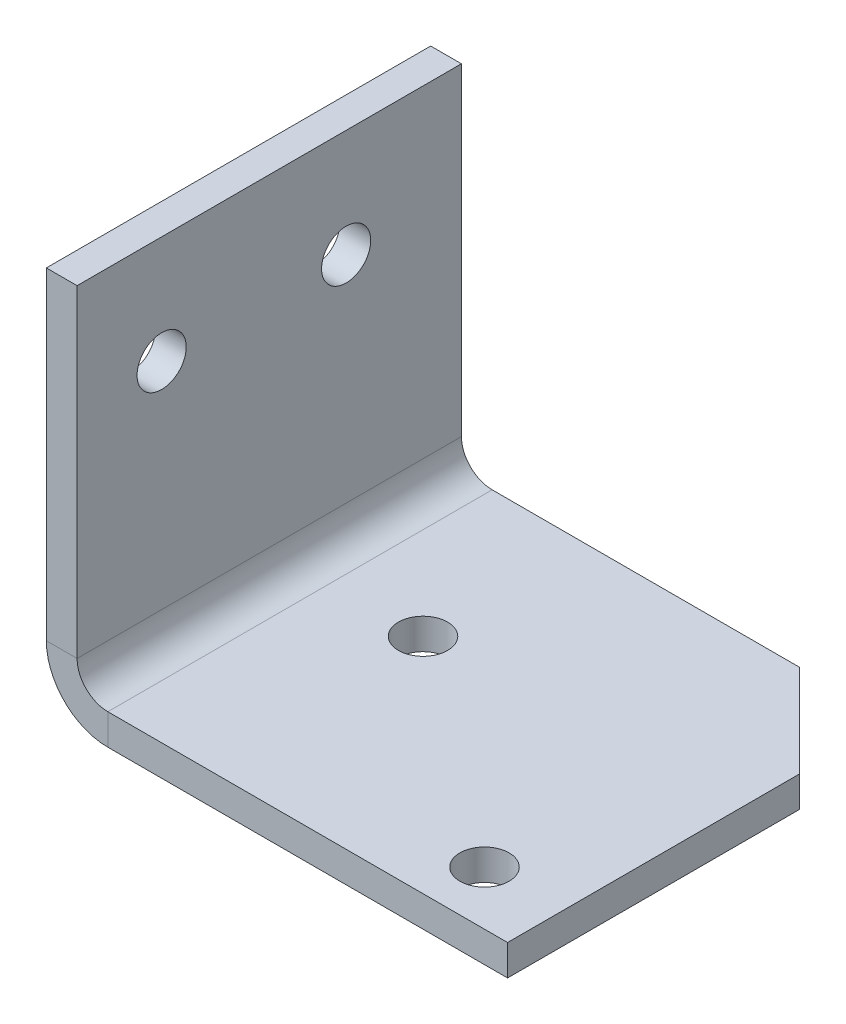
ISO-10303-21;
HEADER;
FILE_DESCRIPTION(('STEP AP214'),'2;1');
FILE_NAME('part.step','',(''),(''),'','','');
FILE_SCHEMA(('AUTOMOTIVE_DESIGN { 1 0 10303 214 1 1 1 1 }'));
ENDSEC;
DATA;
#1=APPLICATION_CONTEXT('core data for automotive mechanical design processes');
#2=APPLICATION_PROTOCOL_DEFINITION('international standard','automotive_design',2000,#1);
#3=PRODUCT_CONTEXT('',#1,'mechanical');
#4=PRODUCT('Part','Part','',(#3));
#5=PRODUCT_RELATED_PRODUCT_CATEGORY('part','',(#4));
#6=PRODUCT_DEFINITION_FORMATION('','',#4);
#7=PRODUCT_DEFINITION_CONTEXT('part definition',#1,'design');
#8=PRODUCT_DEFINITION('design','',#6,#7);
#9=PRODUCT_DEFINITION_SHAPE('','',#8);
#10=(LENGTH_UNIT() NAMED_UNIT(*) SI_UNIT(.MILLI.,.METRE.));
#11=(NAMED_UNIT(*) PLANE_ANGLE_UNIT() SI_UNIT($,.RADIAN.));
#12=(NAMED_UNIT(*) SI_UNIT($,.STERADIAN.) SOLID_ANGLE_UNIT());
#13=UNCERTAINTY_MEASURE_WITH_UNIT(LENGTH_MEASURE(1.E-05),#10,'distance_accuracy_value','');
#14=(GEOMETRIC_REPRESENTATION_CONTEXT(3) GLOBAL_UNCERTAINTY_ASSIGNED_CONTEXT((#13)) GLOBAL_UNIT_ASSIGNED_CONTEXT((#10,
#11,#12)) REPRESENTATION_CONTEXT('',''));
#15=CARTESIAN_POINT('',(0.,0.,0.));
#16=DIRECTION('',(0.,0.,1.));
#17=DIRECTION('',(1.,0.,0.));
#18=AXIS2_PLACEMENT_3D('',#15,#16,#17);
#19=CARTESIAN_POINT('',(2.,25.,0.));
#20=DIRECTION('',(0.,0.,-1.));
#21=DIRECTION('',(0.,1.,0.));
#22=AXIS2_PLACEMENT_3D('',#19,#20,#21);
#23=PLANE('',#22);
#24=DIRECTION('',(-1.,0.,0.));
#25=VECTOR('',#24,1.);
#26=CARTESIAN_POINT('',(2.,3.99999999999999,0.));
#27=LINE('',#26,#25);
#28=CARTESIAN_POINT('',(2.,3.99999999999999,0.));
#29=VERTEX_POINT('',#28);
#30=CARTESIAN_POINT('',(0.,3.99999999999999,0.));
#31=VERTEX_POINT('',#30);
#32=EDGE_CURVE('E190',#29,#31,#27,.T.);
#33=ORIENTED_EDGE('',*,*,#32,.F.);
#34=DIRECTION('',(0.,-1.,0.));
#35=VECTOR('',#34,1.);
#36=CARTESIAN_POINT('',(2.,25.,0.));
#37=LINE('',#36,#35);
#38=CARTESIAN_POINT('',(2.,25.,0.));
#39=VERTEX_POINT('',#38);
#40=EDGE_CURVE('E195',#39,#29,#37,.T.);
#41=ORIENTED_EDGE('',*,*,#40,.F.);
#42=DIRECTION('',(-1.,0.,0.));
#43=VECTOR('',#42,1.);
#44=CARTESIAN_POINT('',(2.,25.,0.));
#45=LINE('',#44,#43);
#46=CARTESIAN_POINT('',(0.,25.,0.));
#47=VERTEX_POINT('',#46);
#48=EDGE_CURVE('E203',#39,#47,#45,.T.);
#49=ORIENTED_EDGE('',*,*,#48,.T.);
#50=DIRECTION('',(0.,-1.,0.));
#51=VECTOR('',#50,1.);
#52=CARTESIAN_POINT('',(0.,25.,0.));
#53=LINE('',#52,#51);
#54=EDGE_CURVE('E193',#47,#31,#53,.T.);
#55=ORIENTED_EDGE('',*,*,#54,.T.);
#56=EDGE_LOOP('',(#33,#41,#49,#55));
#57=FACE_BOUND('',#56,.T.);
#58=ADVANCED_FACE('F59',(#57),#23,.F.);
#59=CARTESIAN_POINT('',(2.,25.,-25.));
#60=DIRECTION('',(0.,0.,1.));
#61=DIRECTION('',(1.,0.,0.));
#62=AXIS2_PLACEMENT_3D('',#59,#60,#61);
#63=PLANE('',#62);
#64=DIRECTION('',(-1.,0.,0.));
#65=VECTOR('',#64,1.);
#66=CARTESIAN_POINT('',(2.,3.99999999999999,-25.));
#67=LINE('',#66,#65);
#68=CARTESIAN_POINT('',(2.,3.99999999999999,-25.));
#69=VERTEX_POINT('',#68);
#70=CARTESIAN_POINT('',(0.,3.99999999999999,-25.));
#71=VERTEX_POINT('',#70);
#72=EDGE_CURVE('E179',#69,#71,#67,.T.);
#73=ORIENTED_EDGE('',*,*,#72,.T.);
#74=DIRECTION('',(0.,1.,0.));
#75=VECTOR('',#74,1.);
#76=CARTESIAN_POINT('',(0.,25.,-25.));
#77=LINE('',#76,#75);
#78=CARTESIAN_POINT('',(0.,25.,-25.));
#79=VERTEX_POINT('',#78);
#80=EDGE_CURVE('E206',#71,#79,#77,.T.);
#81=ORIENTED_EDGE('',*,*,#80,.T.);
#82=DIRECTION('',(-1.,0.,0.));
#83=VECTOR('',#82,1.);
#84=CARTESIAN_POINT('',(2.,25.,-25.));
#85=LINE('',#84,#83);
#86=CARTESIAN_POINT('',(2.,25.,-25.));
#87=VERTEX_POINT('',#86);
#88=EDGE_CURVE('E211',#87,#79,#85,.T.);
#89=ORIENTED_EDGE('',*,*,#88,.F.);
#90=DIRECTION('',(0.,1.,0.));
#91=VECTOR('',#90,1.);
#92=CARTESIAN_POINT('',(2.,25.,-25.));
#93=LINE('',#92,#91);
#94=EDGE_CURVE('E198',#69,#87,#93,.T.);
#95=ORIENTED_EDGE('',*,*,#94,.F.);
#96=EDGE_LOOP('',(#73,#81,#89,#95));
#97=FACE_BOUND('',#96,.T.);
#98=ADVANCED_FACE('F239',(#97),#63,.F.);
#99=CARTESIAN_POINT('',(2.,0.,0.));
#100=DIRECTION('',(1.,0.,0.));
#101=DIRECTION('',(0.,0.,-1.));
#102=AXIS2_PLACEMENT_3D('',#99,#100,#101);
#103=PLANE('',#102);
#104=CARTESIAN_POINT('',(2.,18.,-5.49999999999999));
#105=DIRECTION('',(1.,0.,0.));
#106=DIRECTION('',(0.,0.,-1.));
#107=AXIS2_PLACEMENT_3D('',#104,#105,#106);
#108=CIRCLE('',#107,1.6);
#109=CARTESIAN_POINT('',(2.,18.,-7.09999999999999));
#110=VERTEX_POINT('',#109);
#111=EDGE_CURVE('E309',#110,#110,#108,.T.);
#112=ORIENTED_EDGE('',*,*,#111,.F.);
#113=EDGE_LOOP('',(#112));
#114=FACE_BOUND('',#113,.T.);
#115=CARTESIAN_POINT('',(2.,18.,-17.5));
#116=DIRECTION('',(1.,0.,0.));
#117=DIRECTION('',(0.,0.,-1.));
#118=AXIS2_PLACEMENT_3D('',#115,#116,#117);
#119=CIRCLE('',#118,1.6);
#120=CARTESIAN_POINT('',(2.,18.,-19.1));
#121=VERTEX_POINT('',#120);
#122=EDGE_CURVE('E315',#121,#121,#119,.T.);
#123=ORIENTED_EDGE('',*,*,#122,.F.);
#124=EDGE_LOOP('',(#123));
#125=FACE_BOUND('',#124,.T.);
#126=ORIENTED_EDGE('',*,*,#40,.T.);
#127=DIRECTION('',(0.,0.,-1.));
#128=VECTOR('',#127,1.);
#129=CARTESIAN_POINT('',(2.,3.99999999999999,-25.));
#130=LINE('',#129,#128);
#131=EDGE_CURVE('E185',#69,#29,#130,.F.);
#132=ORIENTED_EDGE('',*,*,#131,.F.);
#133=ORIENTED_EDGE('',*,*,#94,.T.);
#134=DIRECTION('',(0.,0.,1.));
#135=VECTOR('',#134,1.);
#136=CARTESIAN_POINT('',(2.,25.,0.));
#137=LINE('',#136,#135);
#138=EDGE_CURVE('E201',#87,#39,#137,.T.);
#139=ORIENTED_EDGE('',*,*,#138,.T.);
#140=EDGE_LOOP('',(#126,#132,#133,#139));
#141=FACE_BOUND('',#140,.T.);
#142=ADVANCED_FACE('F244',(#114,#125,#141),#103,.T.);
#143=CARTESIAN_POINT('',(0.,0.,0.));
#144=DIRECTION('',(1.,0.,0.));
#145=DIRECTION('',(0.,0.,-1.));
#146=AXIS2_PLACEMENT_3D('',#143,#144,#145);
#147=PLANE('',#146);
#148=CARTESIAN_POINT('',(0.,18.,-5.49999999999999));
#149=DIRECTION('',(1.,0.,0.));
#150=DIRECTION('',(0.,0.,-1.));
#151=AXIS2_PLACEMENT_3D('',#148,#149,#150);
#152=CIRCLE('',#151,1.6);
#153=CARTESIAN_POINT('',(0.,18.,-7.09999999999999));
#154=VERTEX_POINT('',#153);
#155=EDGE_CURVE('E312',#154,#154,#152,.T.);
#156=ORIENTED_EDGE('',*,*,#155,.T.);
#157=EDGE_LOOP('',(#156));
#158=FACE_BOUND('',#157,.T.);
#159=CARTESIAN_POINT('',(0.,18.,-17.5));
#160=DIRECTION('',(1.,0.,0.));
#161=DIRECTION('',(0.,0.,-1.));
#162=AXIS2_PLACEMENT_3D('',#159,#160,#161);
#163=CIRCLE('',#162,1.6);
#164=CARTESIAN_POINT('',(0.,18.,-19.1));
#165=VERTEX_POINT('',#164);
#166=EDGE_CURVE('E172',#165,#165,#163,.T.);
#167=ORIENTED_EDGE('',*,*,#166,.T.);
#168=EDGE_LOOP('',(#167));
#169=FACE_BOUND('',#168,.T.);
#170=DIRECTION('',(0.,0.,-1.));
#171=VECTOR('',#170,1.);
#172=CARTESIAN_POINT('',(0.,3.99999999999999,-25.));
#173=LINE('',#172,#171);
#174=EDGE_CURVE('E173',#71,#31,#173,.F.);
#175=ORIENTED_EDGE('',*,*,#174,.T.);
#176=ORIENTED_EDGE('',*,*,#54,.F.);
#177=DIRECTION('',(0.,0.,1.));
#178=VECTOR('',#177,1.);
#179=CARTESIAN_POINT('',(0.,25.,0.));
#180=LINE('',#179,#178);
#181=EDGE_CURVE('E199',#79,#47,#180,.T.);
#182=ORIENTED_EDGE('',*,*,#181,.F.);
#183=ORIENTED_EDGE('',*,*,#80,.F.);
#184=EDGE_LOOP('',(#175,#176,#182,#183));
#185=FACE_BOUND('',#184,.T.);
#186=ADVANCED_FACE('F252',(#158,#169,#185),#147,.F.);
#187=CARTESIAN_POINT('',(2.,25.,0.));
#188=DIRECTION('',(0.,-1.,0.));
#189=DIRECTION('',(0.,0.,-1.));
#190=AXIS2_PLACEMENT_3D('',#187,#188,#189);
#191=PLANE('',#190);
#192=ORIENTED_EDGE('',*,*,#181,.T.);
#193=ORIENTED_EDGE('',*,*,#48,.F.);
#194=ORIENTED_EDGE('',*,*,#138,.F.);
#195=ORIENTED_EDGE('',*,*,#88,.T.);
#196=EDGE_LOOP('',(#192,#193,#194,#195));
#197=FACE_BOUND('',#196,.T.);
#198=ADVANCED_FACE('F248',(#197),#191,.F.);
#199=CARTESIAN_POINT('',(4.,3.99999999999999,0.));
#200=DIRECTION('',(0.,0.,1.));
#201=DIRECTION('',(1.,0.,0.));
#202=AXIS2_PLACEMENT_3D('',#199,#200,#201);
#203=PLANE('',#202);
#204=DIRECTION('',(0.,1.,0.));
#205=VECTOR('',#204,1.);
#206=CARTESIAN_POINT('',(3.99999999999999,0.,0.));
#207=LINE('',#206,#205);
#208=CARTESIAN_POINT('',(3.99999999999999,1.99999999999999,0.));
#209=VERTEX_POINT('',#208);
#210=CARTESIAN_POINT('',(3.99999999999999,0.,0.));
#211=VERTEX_POINT('',#210);
#212=EDGE_CURVE('E154',#209,#211,#207,.F.);
#213=ORIENTED_EDGE('',*,*,#212,.F.);
#214=CARTESIAN_POINT('',(4.,3.99999999999999,0.));
#215=DIRECTION('',(0.,0.,-1.));
#216=DIRECTION('',(-1.,0.,0.));
#217=AXIS2_PLACEMENT_3D('',#214,#215,#216);
#218=CIRCLE('',#217,2.);
#219=EDGE_CURVE('E182',#29,#209,#218,.F.);
#220=ORIENTED_EDGE('',*,*,#219,.F.);
#221=ORIENTED_EDGE('',*,*,#32,.T.);
#222=CARTESIAN_POINT('',(4.,3.99999999999999,0.));
#223=DIRECTION('',(0.,0.,-1.));
#224=DIRECTION('',(-1.,0.,0.));
#225=AXIS2_PLACEMENT_3D('',#222,#223,#224);
#226=CIRCLE('',#225,4.);
#227=EDGE_CURVE('E175',#31,#211,#226,.F.);
#228=ORIENTED_EDGE('',*,*,#227,.T.);
#229=EDGE_LOOP('',(#213,#220,#221,#228));
#230=FACE_BOUND('',#229,.T.);
#231=ADVANCED_FACE('F251',(#230),#203,.T.);
#232=CARTESIAN_POINT('',(4.,3.99999999999999,-25.));
#233=DIRECTION('',(0.,0.,1.));
#234=DIRECTION('',(1.,0.,0.));
#235=AXIS2_PLACEMENT_3D('',#232,#233,#234);
#236=PLANE('',#235);
#237=CARTESIAN_POINT('',(4.,3.99999999999999,-25.));
#238=DIRECTION('',(0.,0.,-1.));
#239=DIRECTION('',(-1.,0.,0.));
#240=AXIS2_PLACEMENT_3D('',#237,#238,#239);
#241=CIRCLE('',#240,2.);
#242=CARTESIAN_POINT('',(3.99999999999999,1.99999999999999,-25.));
#243=VERTEX_POINT('',#242);
#244=EDGE_CURVE('E150',#243,#69,#241,.T.);
#245=ORIENTED_EDGE('',*,*,#244,.F.);
#246=DIRECTION('',(0.,1.,0.));
#247=VECTOR('',#246,1.);
#248=CARTESIAN_POINT('',(3.99999999999999,1.99999999999999,-25.));
#249=LINE('',#248,#247);
#250=CARTESIAN_POINT('',(3.99999999999999,0.,-25.));
#251=VERTEX_POINT('',#250);
#252=EDGE_CURVE('E166',#243,#251,#249,.F.);
#253=ORIENTED_EDGE('',*,*,#252,.T.);
#254=CARTESIAN_POINT('',(4.,3.99999999999999,-25.));
#255=DIRECTION('',(0.,0.,-1.));
#256=DIRECTION('',(-1.,0.,0.));
#257=AXIS2_PLACEMENT_3D('',#254,#255,#256);
#258=CIRCLE('',#257,4.);
#259=EDGE_CURVE('E176',#251,#71,#258,.T.);
#260=ORIENTED_EDGE('',*,*,#259,.T.);
#261=ORIENTED_EDGE('',*,*,#72,.F.);
#262=EDGE_LOOP('',(#245,#253,#260,#261));
#263=FACE_BOUND('',#262,.T.);
#264=ADVANCED_FACE('F226',(#263),#236,.F.);
#265=CARTESIAN_POINT('',(4.,3.99999999999999,-25.));
#266=DIRECTION('',(0.,0.,-1.));
#267=DIRECTION('',(0.,-1.,0.));
#268=AXIS2_PLACEMENT_3D('',#265,#266,#267);
#269=CYLINDRICAL_SURFACE('',#268,4.);
#270=ORIENTED_EDGE('',*,*,#174,.F.);
#271=ORIENTED_EDGE('',*,*,#259,.F.);
#272=DIRECTION('',(0.,0.,-1.));
#273=VECTOR('',#272,1.);
#274=CARTESIAN_POINT('',(3.99999999999999,0.,0.));
#275=LINE('',#274,#273);
#276=EDGE_CURVE('E164',#251,#211,#275,.F.);
#277=ORIENTED_EDGE('',*,*,#276,.T.);
#278=ORIENTED_EDGE('',*,*,#227,.F.);
#279=EDGE_LOOP('',(#270,#271,#277,#278));
#280=FACE_BOUND('',#279,.T.);
#281=ADVANCED_FACE('F262',(#280),#269,.T.);
#282=CARTESIAN_POINT('',(4.,3.99999999999999,-25.));
#283=DIRECTION('',(0.,0.,-1.));
#284=DIRECTION('',(0.,-1.,0.));
#285=AXIS2_PLACEMENT_3D('',#282,#283,#284);
#286=CYLINDRICAL_SURFACE('',#285,2.);
#287=ORIENTED_EDGE('',*,*,#131,.T.);
#288=ORIENTED_EDGE('',*,*,#219,.T.);
#289=DIRECTION('',(0.,0.,-1.));
#290=VECTOR('',#289,1.);
#291=CARTESIAN_POINT('',(3.99999999999999,1.99999999999999,0.));
#292=LINE('',#291,#290);
#293=EDGE_CURVE('E169',#209,#243,#292,.T.);
#294=ORIENTED_EDGE('',*,*,#293,.T.);
#295=ORIENTED_EDGE('',*,*,#244,.T.);
#296=EDGE_LOOP('',(#287,#288,#294,#295));
#297=FACE_BOUND('',#296,.T.);
#298=ADVANCED_FACE('F221',(#297),#286,.F.);
#299=CARTESIAN_POINT('',(30.,0.,-25.));
#300=DIRECTION('',(0.,0.,1.));
#301=DIRECTION('',(1.,0.,0.));
#302=AXIS2_PLACEMENT_3D('',#299,#300,#301);
#303=PLANE('',#302);
#304=DIRECTION('',(-1.,0.,0.));
#305=VECTOR('',#304,1.);
#306=CARTESIAN_POINT('',(30.,1.9999999999999,-25.));
#307=LINE('',#306,#305);
#308=CARTESIAN_POINT('',(24.,1.99999999999992,-25.));
#309=VERTEX_POINT('',#308);
#310=EDGE_CURVE('E162',#243,#309,#307,.F.);
#311=ORIENTED_EDGE('',*,*,#310,.T.);
#312=DIRECTION('',(0.,-1.,0.));
#313=VECTOR('',#312,1.);
#314=CARTESIAN_POINT('',(24.,0.,-25.));
#315=LINE('',#314,#313);
#316=CARTESIAN_POINT('',(24.,0.,-25.));
#317=VERTEX_POINT('',#316);
#318=EDGE_CURVE('E68',#309,#317,#315,.T.);
#319=ORIENTED_EDGE('',*,*,#318,.T.);
#320=DIRECTION('',(1.,0.,0.));
#321=VECTOR('',#320,1.);
#322=CARTESIAN_POINT('',(0.,0.,-25.));
#323=LINE('',#322,#321);
#324=EDGE_CURVE('E141',#251,#317,#323,.T.);
#325=ORIENTED_EDGE('',*,*,#324,.F.);
#326=ORIENTED_EDGE('',*,*,#252,.F.);
#327=EDGE_LOOP('',(#311,#319,#325,#326));
#328=FACE_BOUND('',#327,.T.);
#329=ADVANCED_FACE('F227',(#328),#303,.F.);
#330=CARTESIAN_POINT('',(1.99999999999999,0.,0.));
#331=DIRECTION('',(0.,0.,-1.));
#332=DIRECTION('',(-1.,0.,0.));
#333=AXIS2_PLACEMENT_3D('',#330,#331,#332);
#334=PLANE('',#333);
#335=ORIENTED_EDGE('',*,*,#212,.T.);
#336=DIRECTION('',(-1.,0.,0.));
#337=VECTOR('',#336,1.);
#338=CARTESIAN_POINT('',(0.,0.,0.));
#339=LINE('',#338,#337);
#340=CARTESIAN_POINT('',(30.,0.,0.));
#341=VERTEX_POINT('',#340);
#342=EDGE_CURVE('E136',#341,#211,#339,.T.);
#343=ORIENTED_EDGE('',*,*,#342,.F.);
#344=DIRECTION('',(0.,1.,0.));
#345=VECTOR('',#344,1.);
#346=CARTESIAN_POINT('',(30.,0.,0.));
#347=LINE('',#346,#345);
#348=CARTESIAN_POINT('',(30.,1.9999999999999,0.));
#349=VERTEX_POINT('',#348);
#350=EDGE_CURVE('E144',#341,#349,#347,.T.);
#351=ORIENTED_EDGE('',*,*,#350,.T.);
#352=DIRECTION('',(1.,0.,0.));
#353=VECTOR('',#352,1.);
#354=CARTESIAN_POINT('',(2.,2.,0.));
#355=LINE('',#354,#353);
#356=EDGE_CURVE('E159',#349,#209,#355,.F.);
#357=ORIENTED_EDGE('',*,*,#356,.T.);
#358=EDGE_LOOP('',(#335,#343,#351,#357));
#359=FACE_BOUND('',#358,.T.);
#360=ADVANCED_FACE('F153',(#359),#334,.F.);
#361=CARTESIAN_POINT('',(0.,0.,0.));
#362=DIRECTION('',(0.,1.,0.));
#363=DIRECTION('',(-1.,0.,0.));
#364=AXIS2_PLACEMENT_3D('',#361,#362,#363);
#365=PLANE('',#364);
#366=CARTESIAN_POINT('',(9.99999999999992,0.,-14.5));
#367=DIRECTION('',(0.,1.,0.));
#368=DIRECTION('',(0.,0.,1.));
#369=AXIS2_PLACEMENT_3D('',#366,#367,#368);
#370=CIRCLE('',#369,1.59999999999999);
#371=CARTESIAN_POINT('',(9.99999999999992,0.,-12.9));
#372=VERTEX_POINT('',#371);
#373=EDGE_CURVE('E296',#372,#372,#370,.T.);
#374=ORIENTED_EDGE('',*,*,#373,.T.);
#375=EDGE_LOOP('',(#374));
#376=FACE_BOUND('',#375,.T.);
#377=CARTESIAN_POINT('',(24.9999999999999,0.,-3.5));
#378=DIRECTION('',(0.,1.,0.));
#379=DIRECTION('',(0.,0.,1.));
#380=AXIS2_PLACEMENT_3D('',#377,#378,#379);
#381=CIRCLE('',#380,1.59999999999999);
#382=CARTESIAN_POINT('',(24.9999999999999,0.,-1.90000000000001));
#383=VERTEX_POINT('',#382);
#384=EDGE_CURVE('E306',#383,#383,#381,.T.);
#385=ORIENTED_EDGE('',*,*,#384,.T.);
#386=EDGE_LOOP('',(#385));
#387=FACE_BOUND('',#386,.T.);
#388=ORIENTED_EDGE('',*,*,#324,.T.);
#389=DIRECTION('',(-0.707106781186548,0.,-0.707106781186548));
#390=VECTOR('',#389,1.);
#391=CARTESIAN_POINT('',(30.,0.,-18.9999999999999));
#392=LINE('',#391,#390);
#393=CARTESIAN_POINT('',(30.,0.,-18.9999999999999));
#394=VERTEX_POINT('',#393);
#395=EDGE_CURVE('E13',#317,#394,#392,.F.);
#396=ORIENTED_EDGE('',*,*,#395,.T.);
#397=DIRECTION('',(0.,0.,1.));
#398=VECTOR('',#397,1.);
#399=CARTESIAN_POINT('',(30.,0.,0.));
#400=LINE('',#399,#398);
#401=EDGE_CURVE('E131',#394,#341,#400,.T.);
#402=ORIENTED_EDGE('',*,*,#401,.T.);
#403=ORIENTED_EDGE('',*,*,#342,.T.);
#404=ORIENTED_EDGE('',*,*,#276,.F.);
#405=EDGE_LOOP('',(#388,#396,#402,#403,#404));
#406=FACE_BOUND('',#405,.T.);
#407=ADVANCED_FACE('F133',(#376,#387,#406),#365,.F.);
#408=CARTESIAN_POINT('',(0.,2.00000000000001,0.));
#409=DIRECTION('',(0.,1.,0.));
#410=DIRECTION('',(-1.,0.,0.));
#411=AXIS2_PLACEMENT_3D('',#408,#409,#410);
#412=PLANE('',#411);
#413=CARTESIAN_POINT('',(9.99999999999992,1.99999999999997,-14.5));
#414=DIRECTION('',(0.,1.,0.));
#415=DIRECTION('',(0.,0.,1.));
#416=AXIS2_PLACEMENT_3D('',#413,#414,#415);
#417=CIRCLE('',#416,1.59999999999999);
#418=CARTESIAN_POINT('',(9.99999999999992,1.99999999999997,-12.9));
#419=VERTEX_POINT('',#418);
#420=EDGE_CURVE('E299',#419,#419,#417,.T.);
#421=ORIENTED_EDGE('',*,*,#420,.F.);
#422=EDGE_LOOP('',(#421));
#423=FACE_BOUND('',#422,.T.);
#424=CARTESIAN_POINT('',(24.9999999999999,1.99999999999992,-3.5));
#425=DIRECTION('',(0.,1.,0.));
#426=DIRECTION('',(0.,0.,1.));
#427=AXIS2_PLACEMENT_3D('',#424,#425,#426);
#428=CIRCLE('',#427,1.59999999999999);
#429=CARTESIAN_POINT('',(24.9999999999999,1.99999999999992,-1.90000000000001));
#430=VERTEX_POINT('',#429);
#431=EDGE_CURVE('E301',#430,#430,#428,.T.);
#432=ORIENTED_EDGE('',*,*,#431,.F.);
#433=EDGE_LOOP('',(#432));
#434=FACE_BOUND('',#433,.T.);
#435=DIRECTION('',(0.,0.,-1.));
#436=VECTOR('',#435,1.);
#437=CARTESIAN_POINT('',(30.,1.9999999999999,0.));
#438=LINE('',#437,#436);
#439=CARTESIAN_POINT('',(30.,1.9999999999999,-18.9999999999999));
#440=VERTEX_POINT('',#439);
#441=EDGE_CURVE('E146',#440,#349,#438,.F.);
#442=ORIENTED_EDGE('',*,*,#441,.F.);
#443=DIRECTION('',(0.707106781186548,0.,0.707106781186548));
#444=VECTOR('',#443,1.);
#445=CARTESIAN_POINT('',(24.5,1.99999999999992,-24.5));
#446=LINE('',#445,#444);
#447=EDGE_CURVE('E82',#440,#309,#446,.F.);
#448=ORIENTED_EDGE('',*,*,#447,.T.);
#449=ORIENTED_EDGE('',*,*,#310,.F.);
#450=ORIENTED_EDGE('',*,*,#293,.F.);
#451=ORIENTED_EDGE('',*,*,#356,.F.);
#452=EDGE_LOOP('',(#442,#448,#449,#450,#451));
#453=FACE_BOUND('',#452,.T.);
#454=ADVANCED_FACE('F217',(#423,#434,#453),#412,.T.);
#455=CARTESIAN_POINT('',(30.,0.,0.));
#456=DIRECTION('',(-1.,0.,0.));
#457=DIRECTION('',(0.,-1.,0.));
#458=AXIS2_PLACEMENT_3D('',#455,#456,#457);
#459=PLANE('',#458);
#460=ORIENTED_EDGE('',*,*,#401,.F.);
#461=DIRECTION('',(0.,1.,0.));
#462=VECTOR('',#461,1.);
#463=CARTESIAN_POINT('',(30.,0.,-18.9999999999999));
#464=LINE('',#463,#462);
#465=EDGE_CURVE('E214',#394,#440,#464,.T.);
#466=ORIENTED_EDGE('',*,*,#465,.T.);
#467=ORIENTED_EDGE('',*,*,#441,.T.);
#468=ORIENTED_EDGE('',*,*,#350,.F.);
#469=EDGE_LOOP('',(#460,#466,#467,#468));
#470=FACE_BOUND('',#469,.T.);
#471=ADVANCED_FACE('F145',(#470),#459,.F.);
#472=CARTESIAN_POINT('',(30.,0.,-18.9999999999999));
#473=DIRECTION('',(-0.707106781186547,0.,0.707106781186547));
#474=DIRECTION('',(0.,1.,0.));
#475=AXIS2_PLACEMENT_3D('',#472,#473,#474);
#476=PLANE('',#475);
#477=ORIENTED_EDGE('',*,*,#395,.F.);
#478=ORIENTED_EDGE('',*,*,#318,.F.);
#479=ORIENTED_EDGE('',*,*,#447,.F.);
#480=ORIENTED_EDGE('',*,*,#465,.F.);
#481=EDGE_LOOP('',(#477,#478,#479,#480));
#482=FACE_BOUND('',#481,.T.);
#483=ADVANCED_FACE('F62',(#482),#476,.F.);
#484=CARTESIAN_POINT('',(2.,18.,-17.5));
#485=DIRECTION('',(1.,0.,0.));
#486=DIRECTION('',(0.,0.,-1.));
#487=AXIS2_PLACEMENT_3D('',#484,#485,#486);
#488=CYLINDRICAL_SURFACE('',#487,1.6);
#489=ORIENTED_EDGE('',*,*,#166,.F.);
#490=EDGE_LOOP('',(#489));
#491=FACE_BOUND('',#490,.T.);
#492=ORIENTED_EDGE('',*,*,#122,.T.);
#493=EDGE_LOOP('',(#492));
#494=FACE_BOUND('',#493,.T.);
#495=ADVANCED_FACE('F229',(#491,#494),#488,.F.);
#496=CARTESIAN_POINT('',(2.,18.,-5.49999999999999));
#497=DIRECTION('',(1.,0.,0.));
#498=DIRECTION('',(0.,0.,-1.));
#499=AXIS2_PLACEMENT_3D('',#496,#497,#498);
#500=CYLINDRICAL_SURFACE('',#499,1.6);
#501=ORIENTED_EDGE('',*,*,#155,.F.);
#502=EDGE_LOOP('',(#501));
#503=FACE_BOUND('',#502,.T.);
#504=ORIENTED_EDGE('',*,*,#111,.T.);
#505=EDGE_LOOP('',(#504));
#506=FACE_BOUND('',#505,.T.);
#507=ADVANCED_FACE('F234',(#503,#506),#500,.F.);
#508=CARTESIAN_POINT('',(24.9999999999999,1.99999999999992,-3.5));
#509=DIRECTION('',(0.,1.,0.));
#510=DIRECTION('',(0.,0.,1.));
#511=AXIS2_PLACEMENT_3D('',#508,#509,#510);
#512=CYLINDRICAL_SURFACE('',#511,1.59999999999999);
#513=ORIENTED_EDGE('',*,*,#384,.F.);
#514=EDGE_LOOP('',(#513));
#515=FACE_BOUND('',#514,.T.);
#516=ORIENTED_EDGE('',*,*,#431,.T.);
#517=EDGE_LOOP('',(#516));
#518=FACE_BOUND('',#517,.T.);
#519=ADVANCED_FACE('F283',(#515,#518),#512,.F.);
#520=CARTESIAN_POINT('',(9.99999999999992,1.99999999999997,-14.5));
#521=DIRECTION('',(0.,1.,0.));
#522=DIRECTION('',(0.,0.,1.));
#523=AXIS2_PLACEMENT_3D('',#520,#521,#522);
#524=CYLINDRICAL_SURFACE('',#523,1.59999999999999);
#525=ORIENTED_EDGE('',*,*,#373,.F.);
#526=EDGE_LOOP('',(#525));
#527=FACE_BOUND('',#526,.T.);
#528=ORIENTED_EDGE('',*,*,#420,.T.);
#529=EDGE_LOOP('',(#528));
#530=FACE_BOUND('',#529,.T.);
#531=ADVANCED_FACE('F287',(#527,#530),#524,.F.);
#532=CLOSED_SHELL('',(#58,#98,#142,#186,#198,#231,#264,#281,#298,#329,#360,#407,#454,#471,#483,
#495,#507,#519,#531));
#533=MANIFOLD_SOLID_BREP('B2',#532);
#534=ADVANCED_BREP_SHAPE_REPRESENTATION('',(#18,#533),#14);
#535=SHAPE_DEFINITION_REPRESENTATION(#9,#534);
ENDSEC;
END-ISO-10303-21;
